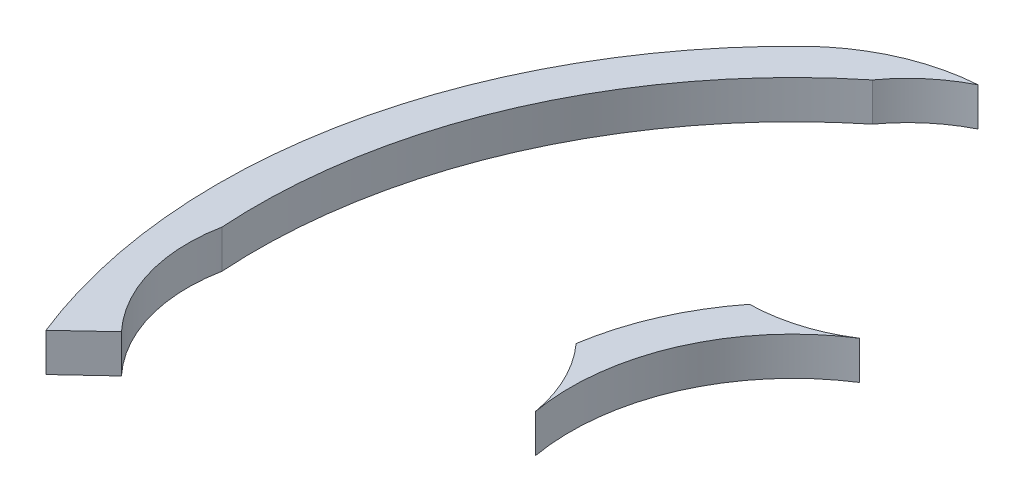
ISO-10303-21;
HEADER;
FILE_DESCRIPTION(('STEP AP214'),'2;1');
FILE_NAME('part.step','',(''),(''),'','','');
FILE_SCHEMA(('AUTOMOTIVE_DESIGN { 1 0 10303 214 1 1 1 1 }'));
ENDSEC;
DATA;
#1=APPLICATION_CONTEXT('core data for automotive mechanical design processes');
#2=APPLICATION_PROTOCOL_DEFINITION('international standard','automotive_design',2000,#1);
#3=PRODUCT_CONTEXT('',#1,'mechanical');
#4=PRODUCT('Part','Part','',(#3));
#5=PRODUCT_RELATED_PRODUCT_CATEGORY('part','',(#4));
#6=PRODUCT_DEFINITION_FORMATION('','',#4);
#7=PRODUCT_DEFINITION_CONTEXT('part definition',#1,'design');
#8=PRODUCT_DEFINITION('design','',#6,#7);
#9=PRODUCT_DEFINITION_SHAPE('','',#8);
#10=(LENGTH_UNIT() NAMED_UNIT(*) SI_UNIT(.MILLI.,.METRE.));
#11=(NAMED_UNIT(*) PLANE_ANGLE_UNIT() SI_UNIT($,.RADIAN.));
#12=(NAMED_UNIT(*) SI_UNIT($,.STERADIAN.) SOLID_ANGLE_UNIT());
#13=UNCERTAINTY_MEASURE_WITH_UNIT(LENGTH_MEASURE(1.E-05),#10,'distance_accuracy_value','');
#14=(GEOMETRIC_REPRESENTATION_CONTEXT(3) GLOBAL_UNCERTAINTY_ASSIGNED_CONTEXT((#13)) GLOBAL_UNIT_ASSIGNED_CONTEXT((#10,
#11,#12)) REPRESENTATION_CONTEXT('',''));
#15=CARTESIAN_POINT('',(0.,0.,0.));
#16=DIRECTION('',(0.,0.,1.));
#17=DIRECTION('',(1.,0.,0.));
#18=AXIS2_PLACEMENT_3D('',#15,#16,#17);
#19=CARTESIAN_POINT('',(-65.5640222322329,5.,20.1195970624359));
#20=DIRECTION('',(0.,-1.,0.));
#21=DIRECTION('',(0.,0.,-1.));
#22=AXIS2_PLACEMENT_3D('',#19,#20,#21);
#23=CYLINDRICAL_SURFACE('',#22,21.);
#24=CARTESIAN_POINT('',(-65.5640222322329,0.,20.1195970624359));
#25=DIRECTION('',(0.,1.,0.));
#26=DIRECTION('',(0.,0.,1.));
#27=AXIS2_PLACEMENT_3D('',#24,#25,#26);
#28=CIRCLE('',#27,21.);
#29=CARTESIAN_POINT('',(-44.8834254158612,0.,16.4709102687148));
#30=VERTEX_POINT('',#29);
#31=CARTESIAN_POINT('',(-49.9075799738795,0.,6.12403291479088));
#32=VERTEX_POINT('',#31);
#33=EDGE_CURVE('E110',#30,#32,#28,.T.);
#34=ORIENTED_EDGE('',*,*,#33,.F.);
#35=DIRECTION('',(0.,-1.,0.));
#36=VECTOR('',#35,1.);
#37=CARTESIAN_POINT('',(-44.8834254158612,5.,16.4709102687148));
#38=LINE('',#37,#36);
#39=CARTESIAN_POINT('',(-44.8834254158612,5.,16.4709102687148));
#40=VERTEX_POINT('',#39);
#41=EDGE_CURVE('E12',#40,#30,#38,.T.);
#42=ORIENTED_EDGE('',*,*,#41,.F.);
#43=CARTESIAN_POINT('',(-65.5640222322329,5.,20.1195970624359));
#44=DIRECTION('',(0.,1.,0.));
#45=DIRECTION('',(0.,0.,1.));
#46=AXIS2_PLACEMENT_3D('',#43,#44,#45);
#47=CIRCLE('',#46,21.);
#48=CARTESIAN_POINT('',(-49.9075799738795,5.,6.12403291479088));
#49=VERTEX_POINT('',#48);
#50=EDGE_CURVE('E103',#40,#49,#47,.T.);
#51=ORIENTED_EDGE('',*,*,#50,.T.);
#52=DIRECTION('',(0.,-1.,0.));
#53=VECTOR('',#52,1.);
#54=CARTESIAN_POINT('',(-49.9075799738795,5.,6.12403291479088));
#55=LINE('',#54,#53);
#56=EDGE_CURVE('E85',#49,#32,#55,.T.);
#57=ORIENTED_EDGE('',*,*,#56,.T.);
#58=EDGE_LOOP('',(#34,#42,#51,#57));
#59=FACE_BOUND('',#58,.T.);
#60=ADVANCED_FACE('F47',(#59),#23,.F.);
#61=CARTESIAN_POINT('',(-16.3245060027764,5.,11.4322475535761));
#62=DIRECTION('',(0.,-1.,0.));
#63=DIRECTION('',(0.,0.,-1.));
#64=AXIS2_PLACEMENT_3D('',#61,#62,#63);
#65=CYLINDRICAL_SURFACE('',#64,29.);
#66=CARTESIAN_POINT('',(-16.3245060027764,0.,11.4322475535761));
#67=DIRECTION('',(0.,1.,0.));
#68=DIRECTION('',(0.,0.,1.));
#69=AXIS2_PLACEMENT_3D('',#66,#67,#68);
#70=CIRCLE('',#69,29.);
#71=CARTESIAN_POINT('',(-32.0272116885604,0.,-12.9485857821745));
#72=VERTEX_POINT('',#71);
#73=EDGE_CURVE('E96',#72,#30,#70,.T.);
#74=ORIENTED_EDGE('',*,*,#73,.F.);
#75=DIRECTION('',(0.,-1.,0.));
#76=VECTOR('',#75,1.);
#77=CARTESIAN_POINT('',(-32.0272116885604,5.,-12.9485857821745));
#78=LINE('',#77,#76);
#79=CARTESIAN_POINT('',(-32.0272116885604,5.,-12.9485857821745));
#80=VERTEX_POINT('',#79);
#81=EDGE_CURVE('E55',#80,#72,#78,.T.);
#82=ORIENTED_EDGE('',*,*,#81,.F.);
#83=CARTESIAN_POINT('',(-16.3245060027764,5.,11.4322475535761));
#84=DIRECTION('',(0.,1.,0.));
#85=DIRECTION('',(0.,0.,1.));
#86=AXIS2_PLACEMENT_3D('',#83,#84,#85);
#87=CIRCLE('',#86,29.);
#88=EDGE_CURVE('E94',#80,#40,#87,.T.);
#89=ORIENTED_EDGE('',*,*,#88,.T.);
#90=ORIENTED_EDGE('',*,*,#41,.T.);
#91=EDGE_LOOP('',(#74,#82,#89,#90));
#92=FACE_BOUND('',#91,.T.);
#93=ADVANCED_FACE('F93',(#92),#65,.F.);
#94=CARTESIAN_POINT('',(-43.3981364955074,5.,-30.6036719908215));
#95=DIRECTION('',(0.,-1.,0.));
#96=DIRECTION('',(0.,0.,-1.));
#97=AXIS2_PLACEMENT_3D('',#94,#95,#96);
#98=CYLINDRICAL_SURFACE('',#97,21.);
#99=CARTESIAN_POINT('',(-43.3981364955074,0.,-30.6036719908215));
#100=DIRECTION('',(0.,1.,0.));
#101=DIRECTION('',(0.,0.,1.));
#102=AXIS2_PLACEMENT_3D('',#99,#100,#101);
#103=CIRCLE('',#102,21.);
#104=CARTESIAN_POINT('',(-43.0332441731559,0.,-9.60684238268564));
#105=VERTEX_POINT('',#104);
#106=EDGE_CURVE('E114',#105,#72,#103,.T.);
#107=ORIENTED_EDGE('',*,*,#106,.F.);
#108=DIRECTION('',(0.,-1.,0.));
#109=VECTOR('',#108,1.);
#110=CARTESIAN_POINT('',(-43.0332441731559,5.,-9.60684238268564));
#111=LINE('',#110,#109);
#112=CARTESIAN_POINT('',(-43.0332441731559,5.,-9.60684238268564));
#113=VERTEX_POINT('',#112);
#114=EDGE_CURVE('E78',#113,#105,#111,.T.);
#115=ORIENTED_EDGE('',*,*,#114,.F.);
#116=CARTESIAN_POINT('',(-43.3981364955074,5.,-30.6036719908215));
#117=DIRECTION('',(0.,1.,0.));
#118=DIRECTION('',(0.,0.,1.));
#119=AXIS2_PLACEMENT_3D('',#116,#117,#118);
#120=CIRCLE('',#119,21.);
#121=EDGE_CURVE('E102',#113,#80,#120,.T.);
#122=ORIENTED_EDGE('',*,*,#121,.T.);
#123=ORIENTED_EDGE('',*,*,#81,.T.);
#124=EDGE_LOOP('',(#107,#115,#122,#123));
#125=FACE_BOUND('',#124,.T.);
#126=ADVANCED_FACE('F105',(#125),#98,.F.);
#127=CARTESIAN_POINT('',(-16.3245060027764,5.,11.4322475535761));
#128=DIRECTION('',(0.,-1.,0.));
#129=DIRECTION('',(0.,0.,-1.));
#130=AXIS2_PLACEMENT_3D('',#127,#128,#129);
#131=CYLINDRICAL_SURFACE('',#130,34.);
#132=CARTESIAN_POINT('',(-16.3245060027764,0.,11.4322475535761));
#133=DIRECTION('',(0.,1.,0.));
#134=DIRECTION('',(0.,0.,1.));
#135=AXIS2_PLACEMENT_3D('',#132,#133,#134);
#136=CIRCLE('',#135,34.);
#137=EDGE_CURVE('E116',#105,#32,#136,.T.);
#138=ORIENTED_EDGE('',*,*,#137,.T.);
#139=ORIENTED_EDGE('',*,*,#56,.F.);
#140=CARTESIAN_POINT('',(-16.3245060027764,5.,11.4322475535761));
#141=DIRECTION('',(0.,1.,0.));
#142=DIRECTION('',(0.,0.,1.));
#143=AXIS2_PLACEMENT_3D('',#140,#141,#142);
#144=CIRCLE('',#143,34.);
#145=EDGE_CURVE('E63',#113,#49,#144,.T.);
#146=ORIENTED_EDGE('',*,*,#145,.F.);
#147=ORIENTED_EDGE('',*,*,#114,.T.);
#148=EDGE_LOOP('',(#138,#139,#146,#147));
#149=FACE_BOUND('',#148,.T.);
#150=ADVANCED_FACE('F126',(#149),#131,.T.);
#151=CARTESIAN_POINT('',(0.,5.,0.));
#152=DIRECTION('',(0.,1.,0.));
#153=DIRECTION('',(0.,0.,1.));
#154=AXIS2_PLACEMENT_3D('',#151,#152,#153);
#155=PLANE('',#154);
#156=ORIENTED_EDGE('',*,*,#50,.F.);
#157=ORIENTED_EDGE('',*,*,#88,.F.);
#158=ORIENTED_EDGE('',*,*,#121,.F.);
#159=ORIENTED_EDGE('',*,*,#145,.T.);
#160=EDGE_LOOP('',(#156,#157,#158,#159));
#161=FACE_BOUND('',#160,.T.);
#162=ADVANCED_FACE('F101',(#161),#155,.T.);
#163=CARTESIAN_POINT('',(0.,0.,0.));
#164=DIRECTION('',(0.,1.,0.));
#165=DIRECTION('',(0.,0.,1.));
#166=AXIS2_PLACEMENT_3D('',#163,#164,#165);
#167=PLANE('',#166);
#168=ORIENTED_EDGE('',*,*,#33,.T.);
#169=ORIENTED_EDGE('',*,*,#137,.F.);
#170=ORIENTED_EDGE('',*,*,#106,.T.);
#171=ORIENTED_EDGE('',*,*,#73,.T.);
#172=EDGE_LOOP('',(#168,#169,#170,#171));
#173=FACE_BOUND('',#172,.T.);
#174=ADVANCED_FACE('F131',(#173),#167,.F.);
#175=CLOSED_SHELL('',(#60,#93,#126,#150,#162,#174));
#176=MANIFOLD_SOLID_BREP('B2',#175);
#177=CARTESIAN_POINT('',(-65.5640222322329,5.,20.1195970624359));
#178=DIRECTION('',(0.,-1.,0.));
#179=DIRECTION('',(0.,0.,-1.));
#180=AXIS2_PLACEMENT_3D('',#177,#178,#179);
#181=CYLINDRICAL_SURFACE('',#180,21.);
#182=CARTESIAN_POINT('',(-65.5640222322329,0.,20.1195970624359));
#183=DIRECTION('',(0.,1.,0.));
#184=DIRECTION('',(0.,0.,1.));
#185=AXIS2_PLACEMENT_3D('',#182,#183,#184);
#186=CIRCLE('',#185,21.);
#187=CARTESIAN_POINT('',(-86.1704913899171,0.,16.0731876845541));
#188=VERTEX_POINT('',#187);
#189=CARTESIAN_POINT('',(-80.9009904348254,0.,34.4645406438051));
#190=VERTEX_POINT('',#189);
#191=EDGE_CURVE('E251',#188,#190,#186,.T.);
#192=ORIENTED_EDGE('',*,*,#191,.F.);
#193=DIRECTION('',(0.,-1.,0.));
#194=VECTOR('',#193,1.);
#195=CARTESIAN_POINT('',(-86.1704913899171,5.,16.0731876845541));
#196=LINE('',#195,#194);
#197=CARTESIAN_POINT('',(-86.1704913899171,5.,16.0731876845541));
#198=VERTEX_POINT('',#197);
#199=EDGE_CURVE('E45',#198,#188,#196,.T.);
#200=ORIENTED_EDGE('',*,*,#199,.F.);
#201=CARTESIAN_POINT('',(-65.5640222322329,5.,20.1195970624359));
#202=DIRECTION('',(0.,1.,0.));
#203=DIRECTION('',(0.,0.,1.));
#204=AXIS2_PLACEMENT_3D('',#201,#202,#203);
#205=CIRCLE('',#204,21.);
#206=CARTESIAN_POINT('',(-80.9009904348254,5.,34.4645406438051));
#207=VERTEX_POINT('',#206);
#208=EDGE_CURVE('E264',#198,#207,#205,.T.);
#209=ORIENTED_EDGE('',*,*,#208,.T.);
#210=DIRECTION('',(0.,-1.,0.));
#211=VECTOR('',#210,1.);
#212=CARTESIAN_POINT('',(-80.9009904348254,5.,34.4645406438051));
#213=LINE('',#212,#211);
#214=EDGE_CURVE('E216',#207,#190,#213,.T.);
#215=ORIENTED_EDGE('',*,*,#214,.T.);
#216=EDGE_LOOP('',(#192,#200,#209,#215));
#217=FACE_BOUND('',#216,.T.);
#218=ADVANCED_FACE('F171',(#217),#181,.F.);
#219=CARTESIAN_POINT('',(-16.3245060027764,5.,11.4322475535761));
#220=DIRECTION('',(0.,-1.,0.));
#221=DIRECTION('',(0.,0.,-1.));
#222=AXIS2_PLACEMENT_3D('',#219,#220,#221);
#223=CYLINDRICAL_SURFACE('',#222,70.);
#224=CARTESIAN_POINT('',(-16.3245060027764,0.,11.4322475535761));
#225=DIRECTION('',(0.,1.,0.));
#226=DIRECTION('',(0.,0.,1.));
#227=AXIS2_PLACEMENT_3D('',#224,#225,#226);
#228=CIRCLE('',#227,70.);
#229=CARTESIAN_POINT('',(-60.3657681877906,0.,-42.9770092429548));
#230=VERTEX_POINT('',#229);
#231=EDGE_CURVE('E254',#230,#188,#228,.T.);
#232=ORIENTED_EDGE('',*,*,#231,.F.);
#233=DIRECTION('',(0.,-1.,0.));
#234=VECTOR('',#233,1.);
#235=CARTESIAN_POINT('',(-60.3657681877906,5.,-42.9770092429548));
#236=LINE('',#235,#234);
#237=CARTESIAN_POINT('',(-60.3657681877906,5.,-42.9770092429548));
#238=VERTEX_POINT('',#237);
#239=EDGE_CURVE('E179',#238,#230,#236,.T.);
#240=ORIENTED_EDGE('',*,*,#239,.F.);
#241=CARTESIAN_POINT('',(-16.3245060027764,5.,11.4322475535761));
#242=DIRECTION('',(0.,1.,0.));
#243=DIRECTION('',(0.,0.,1.));
#244=AXIS2_PLACEMENT_3D('',#241,#242,#243);
#245=CIRCLE('',#244,70.);
#246=EDGE_CURVE('E279',#238,#198,#245,.T.);
#247=ORIENTED_EDGE('',*,*,#246,.T.);
#248=ORIENTED_EDGE('',*,*,#199,.T.);
#249=EDGE_LOOP('',(#232,#240,#247,#248));
#250=FACE_BOUND('',#249,.T.);
#251=ADVANCED_FACE('F273',(#250),#223,.F.);
#252=CARTESIAN_POINT('',(-43.3981364955074,5.,-30.6036719908215));
#253=DIRECTION('',(0.,-1.,0.));
#254=DIRECTION('',(0.,0.,-1.));
#255=AXIS2_PLACEMENT_3D('',#252,#253,#254);
#256=CYLINDRICAL_SURFACE('',#255,21.);
#257=CARTESIAN_POINT('',(-43.3981364955074,0.,-30.6036719908215));
#258=DIRECTION('',(0.,1.,0.));
#259=DIRECTION('',(0.,0.,1.));
#260=AXIS2_PLACEMENT_3D('',#257,#258,#259);
#261=CIRCLE('',#260,21.);
#262=CARTESIAN_POINT('',(-52.9274148783044,0.,-49.3171124415552));
#263=VERTEX_POINT('',#262);
#264=EDGE_CURVE('E257',#263,#230,#261,.T.);
#265=ORIENTED_EDGE('',*,*,#264,.F.);
#266=DIRECTION('',(0.,-1.,0.));
#267=VECTOR('',#266,1.);
#268=CARTESIAN_POINT('',(-52.9274148783044,5.,-49.3171124415552));
#269=LINE('',#268,#267);
#270=CARTESIAN_POINT('',(-52.9274148783044,5.,-49.3171124415552));
#271=VERTEX_POINT('',#270);
#272=EDGE_CURVE('E243',#271,#263,#269,.T.);
#273=ORIENTED_EDGE('',*,*,#272,.F.);
#274=CARTESIAN_POINT('',(-43.3981364955074,5.,-30.6036719908215));
#275=DIRECTION('',(0.,1.,0.));
#276=DIRECTION('',(0.,0.,1.));
#277=AXIS2_PLACEMENT_3D('',#274,#275,#276);
#278=CIRCLE('',#277,21.);
#279=EDGE_CURVE('E236',#271,#238,#278,.T.);
#280=ORIENTED_EDGE('',*,*,#279,.T.);
#281=ORIENTED_EDGE('',*,*,#239,.T.);
#282=EDGE_LOOP('',(#265,#273,#280,#281));
#283=FACE_BOUND('',#282,.T.);
#284=ADVANCED_FACE('F270',(#283),#256,.F.);
#285=CARTESIAN_POINT('',(-51.2217062564328,5.,-24.3753691565067));
#286=DIRECTION('',(0.,-1.,0.));
#287=DIRECTION('',(0.,0.,-1.));
#288=AXIS2_PLACEMENT_3D('',#285,#286,#287);
#289=CYLINDRICAL_SURFACE('',#288,25.);
#290=CARTESIAN_POINT('',(-51.2217062564328,0.,-24.3753691565067));
#291=DIRECTION('',(0.,1.,0.));
#292=DIRECTION('',(0.,0.,1.));
#293=AXIS2_PLACEMENT_3D('',#290,#291,#292);
#294=CIRCLE('',#293,25.);
#295=CARTESIAN_POINT('',(-68.6703063832611,0.,-42.2791775115481));
#296=VERTEX_POINT('',#295);
#297=EDGE_CURVE('E242',#263,#296,#294,.T.);
#298=ORIENTED_EDGE('',*,*,#297,.T.);
#299=DIRECTION('',(0.,-1.,0.));
#300=VECTOR('',#299,1.);
#301=CARTESIAN_POINT('',(-68.6703063832611,5.,-42.2791775115481));
#302=LINE('',#301,#300);
#303=CARTESIAN_POINT('',(-68.6703063832611,5.,-42.2791775115481));
#304=VERTEX_POINT('',#303);
#305=EDGE_CURVE('E239',#304,#296,#302,.T.);
#306=ORIENTED_EDGE('',*,*,#305,.F.);
#307=CARTESIAN_POINT('',(-51.2217062564328,5.,-24.3753691565067));
#308=DIRECTION('',(0.,1.,0.));
#309=DIRECTION('',(0.,0.,1.));
#310=AXIS2_PLACEMENT_3D('',#307,#308,#309);
#311=CIRCLE('',#310,25.);
#312=EDGE_CURVE('E229',#271,#304,#311,.T.);
#313=ORIENTED_EDGE('',*,*,#312,.F.);
#314=ORIENTED_EDGE('',*,*,#272,.T.);
#315=EDGE_LOOP('',(#298,#306,#313,#314));
#316=FACE_BOUND('',#315,.T.);
#317=ADVANCED_FACE('F240',(#316),#289,.T.);
#318=CARTESIAN_POINT('',(-16.3245060027764,5.,11.4322475535761));
#319=DIRECTION('',(0.,-1.,0.));
#320=DIRECTION('',(0.,0.,-1.));
#321=AXIS2_PLACEMENT_3D('',#318,#319,#320);
#322=CYLINDRICAL_SURFACE('',#321,75.);
#323=CARTESIAN_POINT('',(-16.3245060027764,0.,11.4322475535761));
#324=DIRECTION('',(0.,1.,0.));
#325=DIRECTION('',(0.,0.,1.));
#326=AXIS2_PLACEMENT_3D('',#323,#324,#325);
#327=CIRCLE('',#326,75.);
#328=CARTESIAN_POINT('',(-85.9864254339519,0.,39.2210399196436));
#329=VERTEX_POINT('',#328);
#330=EDGE_CURVE('E209',#296,#329,#327,.T.);
#331=ORIENTED_EDGE('',*,*,#330,.T.);
#332=DIRECTION('',(0.,-1.,0.));
#333=VECTOR('',#332,1.);
#334=CARTESIAN_POINT('',(-85.9864254339519,5.,39.2210399196436));
#335=LINE('',#334,#333);
#336=CARTESIAN_POINT('',(-85.9864254339519,5.,39.2210399196436));
#337=VERTEX_POINT('',#336);
#338=EDGE_CURVE('E244',#337,#329,#335,.T.);
#339=ORIENTED_EDGE('',*,*,#338,.F.);
#340=CARTESIAN_POINT('',(-16.3245060027764,5.,11.4322475535761));
#341=DIRECTION('',(0.,1.,0.));
#342=DIRECTION('',(0.,0.,1.));
#343=AXIS2_PLACEMENT_3D('',#340,#341,#342);
#344=CIRCLE('',#343,75.);
#345=EDGE_CURVE('E233',#304,#337,#344,.T.);
#346=ORIENTED_EDGE('',*,*,#345,.F.);
#347=ORIENTED_EDGE('',*,*,#305,.T.);
#348=EDGE_LOOP('',(#331,#339,#346,#347));
#349=FACE_BOUND('',#348,.T.);
#350=ADVANCED_FACE('F246',(#349),#322,.T.);
#351=CARTESIAN_POINT('',(-20.55583507874,5.,-21.9773739221831));
#352=DIRECTION('',(-0.683092551493772,0.,-0.730331819171072));
#353=DIRECTION('',(-0.730331819171072,0.,0.683092551493772));
#354=AXIS2_PLACEMENT_3D('',#351,#352,#353);
#355=PLANE('',#354);
#356=DIRECTION('',(0.730331819171072,0.,-0.683092551493772));
#357=VECTOR('',#356,1.);
#358=CARTESIAN_POINT('',(-20.55583507874,0.,-21.9773739221831));
#359=LINE('',#358,#357);
#360=EDGE_CURVE('E262',#329,#190,#359,.T.);
#361=ORIENTED_EDGE('',*,*,#360,.T.);
#362=ORIENTED_EDGE('',*,*,#214,.F.);
#363=DIRECTION('',(0.730331819171072,0.,-0.683092551493772));
#364=VECTOR('',#363,1.);
#365=CARTESIAN_POINT('',(-20.55583507874,5.,-21.9773739221831));
#366=LINE('',#365,#364);
#367=EDGE_CURVE('E187',#337,#207,#366,.T.);
#368=ORIENTED_EDGE('',*,*,#367,.F.);
#369=ORIENTED_EDGE('',*,*,#338,.T.);
#370=EDGE_LOOP('',(#361,#362,#368,#369));
#371=FACE_BOUND('',#370,.T.);
#372=ADVANCED_FACE('F278',(#371),#355,.F.);
#373=CARTESIAN_POINT('',(0.,5.,0.));
#374=DIRECTION('',(0.,1.,0.));
#375=DIRECTION('',(0.,0.,1.));
#376=AXIS2_PLACEMENT_3D('',#373,#374,#375);
#377=PLANE('',#376);
#378=ORIENTED_EDGE('',*,*,#208,.F.);
#379=ORIENTED_EDGE('',*,*,#246,.F.);
#380=ORIENTED_EDGE('',*,*,#279,.F.);
#381=ORIENTED_EDGE('',*,*,#312,.T.);
#382=ORIENTED_EDGE('',*,*,#345,.T.);
#383=ORIENTED_EDGE('',*,*,#367,.T.);
#384=EDGE_LOOP('',(#378,#379,#380,#381,#382,#383));
#385=FACE_BOUND('',#384,.T.);
#386=ADVANCED_FACE('F231',(#385),#377,.T.);
#387=CARTESIAN_POINT('',(0.,0.,0.));
#388=DIRECTION('',(0.,1.,0.));
#389=DIRECTION('',(0.,0.,1.));
#390=AXIS2_PLACEMENT_3D('',#387,#388,#389);
#391=PLANE('',#390);
#392=ORIENTED_EDGE('',*,*,#191,.T.);
#393=ORIENTED_EDGE('',*,*,#360,.F.);
#394=ORIENTED_EDGE('',*,*,#330,.F.);
#395=ORIENTED_EDGE('',*,*,#297,.F.);
#396=ORIENTED_EDGE('',*,*,#264,.T.);
#397=ORIENTED_EDGE('',*,*,#231,.T.);
#398=EDGE_LOOP('',(#392,#393,#394,#395,#396,#397));
#399=FACE_BOUND('',#398,.T.);
#400=ADVANCED_FACE('F275',(#399),#391,.F.);
#401=CLOSED_SHELL('',(#218,#251,#284,#317,#350,#372,#386,#400));
#402=MANIFOLD_SOLID_BREP('B6_NOT_SHOWN',#401);
#403=ADVANCED_BREP_SHAPE_REPRESENTATION('',(#18,#176,#402),#14);
#404=SHAPE_DEFINITION_REPRESENTATION(#9,#403);
ENDSEC;
END-ISO-10303-21;
